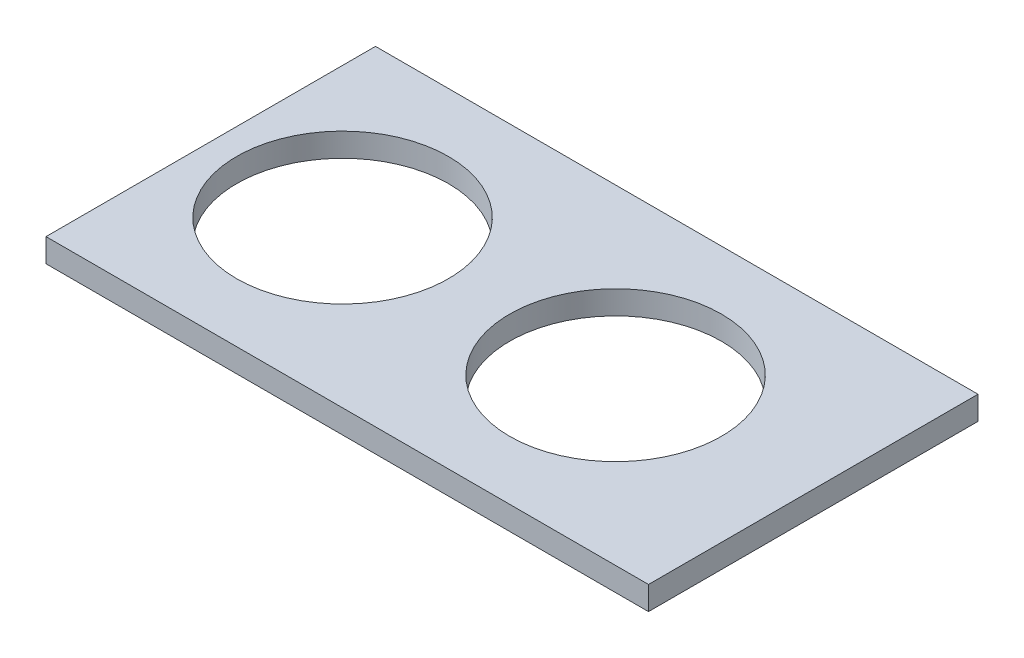
ISO-10303-21;
HEADER;
FILE_DESCRIPTION(('STEP AP214'),'2;1');
FILE_NAME('part.step','',(''),(''),'','','');
FILE_SCHEMA(('AUTOMOTIVE_DESIGN { 1 0 10303 214 1 1 1 1 }'));
ENDSEC;
DATA;
#1=APPLICATION_CONTEXT('core data for automotive mechanical design processes');
#2=APPLICATION_PROTOCOL_DEFINITION('international standard','automotive_design',2000,#1);
#3=PRODUCT_CONTEXT('',#1,'mechanical');
#4=PRODUCT('Part','Part','',(#3));
#5=PRODUCT_RELATED_PRODUCT_CATEGORY('part','',(#4));
#6=PRODUCT_DEFINITION_FORMATION('','',#4);
#7=PRODUCT_DEFINITION_CONTEXT('part definition',#1,'design');
#8=PRODUCT_DEFINITION('design','',#6,#7);
#9=PRODUCT_DEFINITION_SHAPE('','',#8);
#10=(LENGTH_UNIT() NAMED_UNIT(*) SI_UNIT(.MILLI.,.METRE.));
#11=(NAMED_UNIT(*) PLANE_ANGLE_UNIT() SI_UNIT($,.RADIAN.));
#12=(NAMED_UNIT(*) SI_UNIT($,.STERADIAN.) SOLID_ANGLE_UNIT());
#13=UNCERTAINTY_MEASURE_WITH_UNIT(LENGTH_MEASURE(1.E-05),#10,'distance_accuracy_value','');
#14=(GEOMETRIC_REPRESENTATION_CONTEXT(3) GLOBAL_UNCERTAINTY_ASSIGNED_CONTEXT((#13)) GLOBAL_UNIT_ASSIGNED_CONTEXT((#10,
#11,#12)) REPRESENTATION_CONTEXT('',''));
#15=CARTESIAN_POINT('',(0.,0.,0.));
#16=DIRECTION('',(0.,0.,1.));
#17=DIRECTION('',(1.,0.,0.));
#18=AXIS2_PLACEMENT_3D('',#15,#16,#17);
#19=CARTESIAN_POINT('',(0.,3.175,22.225));
#20=DIRECTION('',(0.,0.,-1.));
#21=DIRECTION('',(-1.,0.,0.));
#22=AXIS2_PLACEMENT_3D('',#19,#20,#21);
#23=PLANE('',#22);
#24=DIRECTION('',(1.,0.,0.));
#25=VECTOR('',#24,1.);
#26=CARTESIAN_POINT('',(0.,0.,22.225));
#27=LINE('',#26,#25);
#28=CARTESIAN_POINT('',(-17.78,0.,22.225));
#29=VERTEX_POINT('',#28);
#30=CARTESIAN_POINT('',(63.5,0.,22.225));
#31=VERTEX_POINT('',#30);
#32=EDGE_CURVE('E124',#29,#31,#27,.T.);
#33=ORIENTED_EDGE('',*,*,#32,.T.);
#34=DIRECTION('',(0.,-1.,0.));
#35=VECTOR('',#34,1.);
#36=CARTESIAN_POINT('',(63.5,3.175,22.225));
#37=LINE('',#36,#35);
#38=CARTESIAN_POINT('',(63.5,3.175,22.225));
#39=VERTEX_POINT('',#38);
#40=EDGE_CURVE('E11',#39,#31,#37,.T.);
#41=ORIENTED_EDGE('',*,*,#40,.F.);
#42=DIRECTION('',(1.,0.,0.));
#43=VECTOR('',#42,1.);
#44=CARTESIAN_POINT('',(0.,3.175,22.225));
#45=LINE('',#44,#43);
#46=CARTESIAN_POINT('',(-17.78,3.175,22.225));
#47=VERTEX_POINT('',#46);
#48=EDGE_CURVE('E98',#47,#39,#45,.T.);
#49=ORIENTED_EDGE('',*,*,#48,.F.);
#50=DIRECTION('',(0.,-1.,0.));
#51=VECTOR('',#50,1.);
#52=CARTESIAN_POINT('',(-17.78,3.175,22.225));
#53=LINE('',#52,#51);
#54=EDGE_CURVE('E65',#47,#29,#53,.T.);
#55=ORIENTED_EDGE('',*,*,#54,.T.);
#56=EDGE_LOOP('',(#33,#41,#49,#55));
#57=FACE_BOUND('',#56,.T.);
#58=ADVANCED_FACE('F47',(#57),#23,.F.);
#59=CARTESIAN_POINT('',(63.5,3.175,0.));
#60=DIRECTION('',(-1.,0.,0.));
#61=DIRECTION('',(0.,0.,1.));
#62=AXIS2_PLACEMENT_3D('',#59,#60,#61);
#63=PLANE('',#62);
#64=DIRECTION('',(0.,0.,-1.));
#65=VECTOR('',#64,1.);
#66=CARTESIAN_POINT('',(63.5,0.,0.));
#67=LINE('',#66,#65);
#68=CARTESIAN_POINT('',(63.5,0.,-22.225));
#69=VERTEX_POINT('',#68);
#70=EDGE_CURVE('E104',#31,#69,#67,.T.);
#71=ORIENTED_EDGE('',*,*,#70,.T.);
#72=DIRECTION('',(0.,-1.,0.));
#73=VECTOR('',#72,1.);
#74=CARTESIAN_POINT('',(63.5,3.175,-22.225));
#75=LINE('',#74,#73);
#76=CARTESIAN_POINT('',(63.5,3.175,-22.225));
#77=VERTEX_POINT('',#76);
#78=EDGE_CURVE('E57',#77,#69,#75,.T.);
#79=ORIENTED_EDGE('',*,*,#78,.F.);
#80=DIRECTION('',(0.,0.,-1.));
#81=VECTOR('',#80,1.);
#82=CARTESIAN_POINT('',(63.5,3.175,0.));
#83=LINE('',#82,#81);
#84=EDGE_CURVE('E90',#39,#77,#83,.T.);
#85=ORIENTED_EDGE('',*,*,#84,.F.);
#86=ORIENTED_EDGE('',*,*,#40,.T.);
#87=EDGE_LOOP('',(#71,#79,#85,#86));
#88=FACE_BOUND('',#87,.T.);
#89=ADVANCED_FACE('F103',(#88),#63,.F.);
#90=CARTESIAN_POINT('',(0.,3.175,-22.225));
#91=DIRECTION('',(0.,0.,-1.));
#92=DIRECTION('',(-1.,0.,0.));
#93=AXIS2_PLACEMENT_3D('',#90,#91,#92);
#94=PLANE('',#93);
#95=DIRECTION('',(1.,0.,0.));
#96=VECTOR('',#95,1.);
#97=CARTESIAN_POINT('',(0.,0.,-22.225));
#98=LINE('',#97,#96);
#99=CARTESIAN_POINT('',(-17.78,0.,-22.225));
#100=VERTEX_POINT('',#99);
#101=EDGE_CURVE('E129',#100,#69,#98,.T.);
#102=ORIENTED_EDGE('',*,*,#101,.F.);
#103=DIRECTION('',(0.,-1.,0.));
#104=VECTOR('',#103,1.);
#105=CARTESIAN_POINT('',(-17.78,3.175,-22.225));
#106=LINE('',#105,#104);
#107=CARTESIAN_POINT('',(-17.78,3.175,-22.225));
#108=VERTEX_POINT('',#107);
#109=EDGE_CURVE('E79',#108,#100,#106,.T.);
#110=ORIENTED_EDGE('',*,*,#109,.F.);
#111=DIRECTION('',(1.,0.,0.));
#112=VECTOR('',#111,1.);
#113=CARTESIAN_POINT('',(0.,3.175,-22.225));
#114=LINE('',#113,#112);
#115=EDGE_CURVE('E97',#108,#77,#114,.T.);
#116=ORIENTED_EDGE('',*,*,#115,.T.);
#117=ORIENTED_EDGE('',*,*,#78,.T.);
#118=EDGE_LOOP('',(#102,#110,#116,#117));
#119=FACE_BOUND('',#118,.T.);
#120=ADVANCED_FACE('F108',(#119),#94,.T.);
#121=CARTESIAN_POINT('',(0.,3.175,0.));
#122=DIRECTION('',(0.,-1.,0.));
#123=DIRECTION('',(0.,0.,-1.));
#124=AXIS2_PLACEMENT_3D('',#121,#122,#123);
#125=CYLINDRICAL_SURFACE('',#124,14.2875);
#126=CARTESIAN_POINT('',(0.,3.175,0.));
#127=DIRECTION('',(0.,1.,0.));
#128=DIRECTION('',(0.,0.,1.));
#129=AXIS2_PLACEMENT_3D('',#126,#127,#128);
#130=CIRCLE('',#129,14.2875);
#131=CARTESIAN_POINT('',(0.,3.175,14.2875));
#132=VERTEX_POINT('',#131);
#133=EDGE_CURVE('E143',#132,#132,#130,.T.);
#134=ORIENTED_EDGE('',*,*,#133,.T.);
#135=EDGE_LOOP('',(#134));
#136=FACE_BOUND('',#135,.T.);
#137=CARTESIAN_POINT('',(0.,0.,0.));
#138=DIRECTION('',(0.,1.,0.));
#139=DIRECTION('',(0.,0.,1.));
#140=AXIS2_PLACEMENT_3D('',#137,#138,#139);
#141=CIRCLE('',#140,14.2875);
#142=CARTESIAN_POINT('',(0.,0.,14.2875));
#143=VERTEX_POINT('',#142);
#144=EDGE_CURVE('E120',#143,#143,#141,.T.);
#145=ORIENTED_EDGE('',*,*,#144,.F.);
#146=EDGE_LOOP('',(#145));
#147=FACE_BOUND('',#146,.T.);
#148=ADVANCED_FACE('F153',(#136,#147),#125,.F.);
#149=CARTESIAN_POINT('',(36.83,3.175,0.));
#150=DIRECTION('',(0.,-1.,0.));
#151=DIRECTION('',(0.,0.,-1.));
#152=AXIS2_PLACEMENT_3D('',#149,#150,#151);
#153=CYLINDRICAL_SURFACE('',#152,14.2875);
#154=CARTESIAN_POINT('',(36.83,3.175,0.));
#155=DIRECTION('',(0.,1.,0.));
#156=DIRECTION('',(0.,0.,1.));
#157=AXIS2_PLACEMENT_3D('',#154,#155,#156);
#158=CIRCLE('',#157,14.2875);
#159=CARTESIAN_POINT('',(36.83,3.175,14.2875));
#160=VERTEX_POINT('',#159);
#161=EDGE_CURVE('E136',#160,#160,#158,.T.);
#162=ORIENTED_EDGE('',*,*,#161,.T.);
#163=EDGE_LOOP('',(#162));
#164=FACE_BOUND('',#163,.T.);
#165=CARTESIAN_POINT('',(36.83,0.,0.));
#166=DIRECTION('',(0.,1.,0.));
#167=DIRECTION('',(0.,0.,1.));
#168=AXIS2_PLACEMENT_3D('',#165,#166,#167);
#169=CIRCLE('',#168,14.2875);
#170=CARTESIAN_POINT('',(36.83,0.,14.2875));
#171=VERTEX_POINT('',#170);
#172=EDGE_CURVE('E116',#171,#171,#169,.T.);
#173=ORIENTED_EDGE('',*,*,#172,.F.);
#174=EDGE_LOOP('',(#173));
#175=FACE_BOUND('',#174,.T.);
#176=ADVANCED_FACE('F49',(#164,#175),#153,.F.);
#177=CARTESIAN_POINT('',(-17.78,3.175,0.));
#178=DIRECTION('',(-1.,0.,0.));
#179=DIRECTION('',(0.,0.,1.));
#180=AXIS2_PLACEMENT_3D('',#177,#178,#179);
#181=PLANE('',#180);
#182=DIRECTION('',(0.,0.,-1.));
#183=VECTOR('',#182,1.);
#184=CARTESIAN_POINT('',(-17.78,0.,0.));
#185=LINE('',#184,#183);
#186=EDGE_CURVE('E132',#29,#100,#185,.T.);
#187=ORIENTED_EDGE('',*,*,#186,.F.);
#188=ORIENTED_EDGE('',*,*,#54,.F.);
#189=DIRECTION('',(0.,0.,-1.));
#190=VECTOR('',#189,1.);
#191=CARTESIAN_POINT('',(-17.78,3.175,0.));
#192=LINE('',#191,#190);
#193=EDGE_CURVE('E110',#47,#108,#192,.T.);
#194=ORIENTED_EDGE('',*,*,#193,.T.);
#195=ORIENTED_EDGE('',*,*,#109,.T.);
#196=EDGE_LOOP('',(#187,#188,#194,#195));
#197=FACE_BOUND('',#196,.T.);
#198=ADVANCED_FACE('F158',(#197),#181,.T.);
#199=CARTESIAN_POINT('',(0.,3.175,0.));
#200=DIRECTION('',(0.,1.,0.));
#201=DIRECTION('',(0.,0.,1.));
#202=AXIS2_PLACEMENT_3D('',#199,#200,#201);
#203=PLANE('',#202);
#204=ORIENTED_EDGE('',*,*,#161,.F.);
#205=EDGE_LOOP('',(#204));
#206=FACE_BOUND('',#205,.T.);
#207=ORIENTED_EDGE('',*,*,#133,.F.);
#208=EDGE_LOOP('',(#207));
#209=FACE_BOUND('',#208,.T.);
#210=ORIENTED_EDGE('',*,*,#48,.T.);
#211=ORIENTED_EDGE('',*,*,#84,.T.);
#212=ORIENTED_EDGE('',*,*,#115,.F.);
#213=ORIENTED_EDGE('',*,*,#193,.F.);
#214=EDGE_LOOP('',(#210,#211,#212,#213));
#215=FACE_BOUND('',#214,.T.);
#216=ADVANCED_FACE('F94',(#206,#209,#215),#203,.T.);
#217=CARTESIAN_POINT('',(0.,0.,0.));
#218=DIRECTION('',(0.,1.,0.));
#219=DIRECTION('',(0.,0.,1.));
#220=AXIS2_PLACEMENT_3D('',#217,#218,#219);
#221=PLANE('',#220);
#222=ORIENTED_EDGE('',*,*,#172,.T.);
#223=EDGE_LOOP('',(#222));
#224=FACE_BOUND('',#223,.T.);
#225=ORIENTED_EDGE('',*,*,#144,.T.);
#226=EDGE_LOOP('',(#225));
#227=FACE_BOUND('',#226,.T.);
#228=ORIENTED_EDGE('',*,*,#32,.F.);
#229=ORIENTED_EDGE('',*,*,#186,.T.);
#230=ORIENTED_EDGE('',*,*,#101,.T.);
#231=ORIENTED_EDGE('',*,*,#70,.F.);
#232=EDGE_LOOP('',(#228,#229,#230,#231));
#233=FACE_BOUND('',#232,.T.);
#234=ADVANCED_FACE('F157',(#224,#227,#233),#221,.F.);
#235=CLOSED_SHELL('',(#58,#89,#120,#148,#176,#198,#216,#234));
#236=MANIFOLD_SOLID_BREP('B2',#235);
#237=ADVANCED_BREP_SHAPE_REPRESENTATION('',(#18,#236),#14);
#238=SHAPE_DEFINITION_REPRESENTATION(#9,#237);
ENDSEC;
END-ISO-10303-21;
